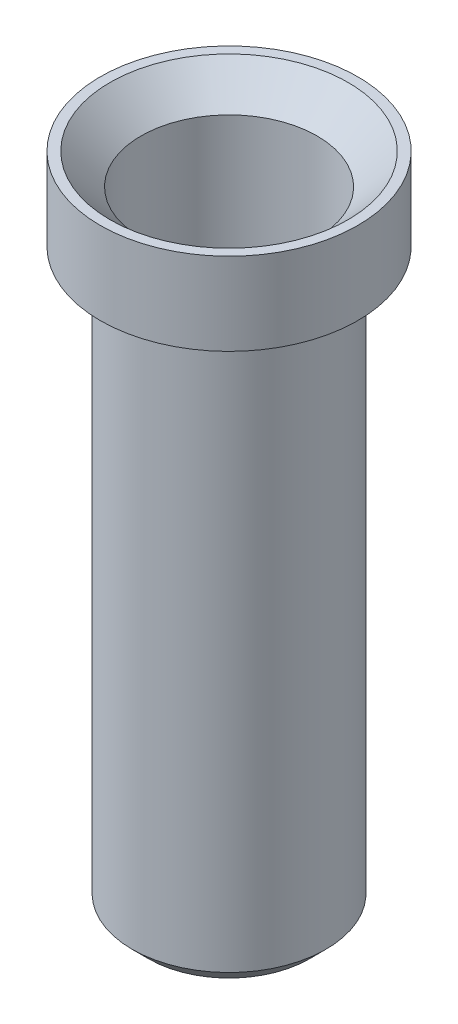
ISO-10303-21;
HEADER;
FILE_DESCRIPTION(('STEP AP214'),'2;1');
FILE_NAME('part.step','',(''),(''),'','','');
FILE_SCHEMA(('AUTOMOTIVE_DESIGN { 1 0 10303 214 1 1 1 1 }'));
ENDSEC;
DATA;
#1=APPLICATION_CONTEXT('core data for automotive mechanical design processes');
#2=APPLICATION_PROTOCOL_DEFINITION('international standard','automotive_design',2000,#1);
#3=PRODUCT_CONTEXT('',#1,'mechanical');
#4=PRODUCT('Part','Part','',(#3));
#5=PRODUCT_RELATED_PRODUCT_CATEGORY('part','',(#4));
#6=PRODUCT_DEFINITION_FORMATION('','',#4);
#7=PRODUCT_DEFINITION_CONTEXT('part definition',#1,'design');
#8=PRODUCT_DEFINITION('design','',#6,#7);
#9=PRODUCT_DEFINITION_SHAPE('','',#8);
#10=(LENGTH_UNIT() NAMED_UNIT(*) SI_UNIT(.MILLI.,.METRE.));
#11=(NAMED_UNIT(*) PLANE_ANGLE_UNIT() SI_UNIT($,.RADIAN.));
#12=(NAMED_UNIT(*) SI_UNIT($,.STERADIAN.) SOLID_ANGLE_UNIT());
#13=UNCERTAINTY_MEASURE_WITH_UNIT(LENGTH_MEASURE(1.E-05),#10,'distance_accuracy_value','');
#14=(GEOMETRIC_REPRESENTATION_CONTEXT(3) GLOBAL_UNCERTAINTY_ASSIGNED_CONTEXT((#13)) GLOBAL_UNIT_ASSIGNED_CONTEXT((#10,
#11,#12)) REPRESENTATION_CONTEXT('',''));
#15=CARTESIAN_POINT('',(0.,0.,0.));
#16=DIRECTION('',(0.,0.,1.));
#17=DIRECTION('',(1.,0.,0.));
#18=AXIS2_PLACEMENT_3D('',#15,#16,#17);
#19=CARTESIAN_POINT('',(0.,-5.6,0.));
#20=DIRECTION('',(0.,-1.,0.));
#21=DIRECTION('',(0.,0.,-1.));
#22=AXIS2_PLACEMENT_3D('',#19,#20,#21);
#23=PLANE('',#22);
#24=CARTESIAN_POINT('',(0.,-5.6,0.));
#25=DIRECTION('',(0.,-1.,0.));
#26=DIRECTION('',(0.,0.,-1.));
#27=AXIS2_PLACEMENT_3D('',#24,#25,#26);
#28=CIRCLE('',#27,0.779999999999999);
#29=CARTESIAN_POINT('',(0.,-5.6,0.78));
#30=VERTEX_POINT('',#29);
#31=EDGE_CURVE('E11',#30,#30,#28,.T.);
#32=ORIENTED_EDGE('',*,*,#31,.T.);
#33=EDGE_LOOP('',(#32));
#34=FACE_BOUND('',#33,.T.);
#35=ADVANCED_FACE('F35',(#34),#23,.T.);
#36=CARTESIAN_POINT('',(0.,8.23878905517164,0.));
#37=DIRECTION('',(0.,1.,0.));
#38=DIRECTION('',(0.,0.,1.));
#39=AXIS2_PLACEMENT_3D('',#36,#37,#38);
#40=CYLINDRICAL_SURFACE('',#39,0.94);
#41=CARTESIAN_POINT('',(0.,-5.44,0.));
#42=DIRECTION('',(0.,-1.,0.));
#43=DIRECTION('',(0.,0.,-1.));
#44=AXIS2_PLACEMENT_3D('',#41,#42,#43);
#45=CIRCLE('',#44,0.94);
#46=CARTESIAN_POINT('',(0.,-5.44,0.94));
#47=VERTEX_POINT('',#46);
#48=EDGE_CURVE('E42',#47,#47,#45,.F.);
#49=ORIENTED_EDGE('',*,*,#48,.T.);
#50=EDGE_LOOP('',(#49));
#51=FACE_BOUND('',#50,.T.);
#52=CARTESIAN_POINT('',(0.,0.,0.));
#53=DIRECTION('',(0.,1.,0.));
#54=DIRECTION('',(0.,0.,1.));
#55=AXIS2_PLACEMENT_3D('',#52,#53,#54);
#56=CIRCLE('',#55,0.940000000000001);
#57=CARTESIAN_POINT('',(0.,0.,0.940000000000001));
#58=VERTEX_POINT('',#57);
#59=EDGE_CURVE('E102',#58,#58,#56,.T.);
#60=ORIENTED_EDGE('',*,*,#59,.F.);
#61=EDGE_LOOP('',(#60));
#62=FACE_BOUND('',#61,.T.);
#63=ADVANCED_FACE('F60',(#51,#62),#40,.T.);
#64=CARTESIAN_POINT('',(-0.940000000000001,0.,0.));
#65=DIRECTION('',(0.,-1.,0.));
#66=DIRECTION('',(0.,0.,-1.));
#67=AXIS2_PLACEMENT_3D('',#64,#65,#66);
#68=PLANE('',#67);
#69=ORIENTED_EDGE('',*,*,#59,.T.);
#70=EDGE_LOOP('',(#69));
#71=FACE_BOUND('',#70,.T.);
#72=CARTESIAN_POINT('',(0.,0.,0.));
#73=DIRECTION('',(0.,1.,0.));
#74=DIRECTION('',(0.,0.,1.));
#75=AXIS2_PLACEMENT_3D('',#72,#73,#74);
#76=CIRCLE('',#75,1.25);
#77=CARTESIAN_POINT('',(0.,0.,1.25));
#78=VERTEX_POINT('',#77);
#79=EDGE_CURVE('E99',#78,#78,#76,.T.);
#80=ORIENTED_EDGE('',*,*,#79,.F.);
#81=EDGE_LOOP('',(#80));
#82=FACE_BOUND('',#81,.T.);
#83=ADVANCED_FACE('F65',(#71,#82),#68,.T.);
#84=CARTESIAN_POINT('',(0.,8.23878905517164,0.));
#85=DIRECTION('',(0.,1.,0.));
#86=DIRECTION('',(0.,0.,1.));
#87=AXIS2_PLACEMENT_3D('',#84,#85,#86);
#88=CYLINDRICAL_SURFACE('',#87,1.25);
#89=ORIENTED_EDGE('',*,*,#79,.T.);
#90=EDGE_LOOP('',(#89));
#91=FACE_BOUND('',#90,.T.);
#92=CARTESIAN_POINT('',(0.,0.799999999999999,0.));
#93=DIRECTION('',(0.,1.,0.));
#94=DIRECTION('',(0.,0.,1.));
#95=AXIS2_PLACEMENT_3D('',#92,#93,#94);
#96=CIRCLE('',#95,1.25);
#97=CARTESIAN_POINT('',(0.,0.799999999999999,1.25));
#98=VERTEX_POINT('',#97);
#99=EDGE_CURVE('E93',#98,#98,#96,.T.);
#100=ORIENTED_EDGE('',*,*,#99,.F.);
#101=EDGE_LOOP('',(#100));
#102=FACE_BOUND('',#101,.T.);
#103=ADVANCED_FACE('F71',(#91,#102),#88,.T.);
#104=CARTESIAN_POINT('',(-1.25,0.799999999999999,0.));
#105=DIRECTION('',(0.,1.,0.));
#106=DIRECTION('',(0.,0.,1.));
#107=AXIS2_PLACEMENT_3D('',#104,#105,#106);
#108=PLANE('',#107);
#109=ORIENTED_EDGE('',*,*,#99,.T.);
#110=EDGE_LOOP('',(#109));
#111=FACE_BOUND('',#110,.T.);
#112=CARTESIAN_POINT('',(0.,0.799999999999999,0.));
#113=DIRECTION('',(0.,1.,0.));
#114=DIRECTION('',(0.,0.,1.));
#115=AXIS2_PLACEMENT_3D('',#112,#113,#114);
#116=CIRCLE('',#115,1.155);
#117=CARTESIAN_POINT('',(0.,0.799999999999999,1.155));
#118=VERTEX_POINT('',#117);
#119=EDGE_CURVE('E87',#118,#118,#116,.T.);
#120=ORIENTED_EDGE('',*,*,#119,.F.);
#121=EDGE_LOOP('',(#120));
#122=FACE_BOUND('',#121,.T.);
#123=ADVANCED_FACE('F75',(#111,#122),#108,.T.);
#124=CARTESIAN_POINT('',(0.,0.5,0.));
#125=DIRECTION('',(0.,1.,0.));
#126=DIRECTION('',(0.,0.,1.));
#127=AXIS2_PLACEMENT_3D('',#124,#125,#126);
#128=CONICAL_SURFACE('',#127,0.854999999999999,0.785398163397449);
#129=ORIENTED_EDGE('',*,*,#119,.T.);
#130=EDGE_LOOP('',(#129));
#131=FACE_BOUND('',#130,.T.);
#132=CARTESIAN_POINT('',(0.,0.5,0.));
#133=DIRECTION('',(0.,1.,0.));
#134=DIRECTION('',(0.,0.,1.));
#135=AXIS2_PLACEMENT_3D('',#132,#133,#134);
#136=CIRCLE('',#135,0.854999999999999);
#137=CARTESIAN_POINT('',(0.,0.5,0.854999999999999));
#138=VERTEX_POINT('',#137);
#139=EDGE_CURVE('E90',#138,#138,#136,.T.);
#140=ORIENTED_EDGE('',*,*,#139,.F.);
#141=EDGE_LOOP('',(#140));
#142=FACE_BOUND('',#141,.T.);
#143=ADVANCED_FACE('F55',(#131,#142),#128,.F.);
#144=CARTESIAN_POINT('',(0.,8.23878905517164,0.));
#145=DIRECTION('',(0.,1.,0.));
#146=DIRECTION('',(0.,0.,1.));
#147=AXIS2_PLACEMENT_3D('',#144,#145,#146);
#148=CYLINDRICAL_SURFACE('',#147,0.854999999999999);
#149=ORIENTED_EDGE('',*,*,#139,.T.);
#150=EDGE_LOOP('',(#149));
#151=FACE_BOUND('',#150,.T.);
#152=CARTESIAN_POINT('',(0.,-4.4,0.));
#153=DIRECTION('',(0.,1.,0.));
#154=DIRECTION('',(0.,0.,1.));
#155=AXIS2_PLACEMENT_3D('',#152,#153,#154);
#156=CIRCLE('',#155,0.854999999999998);
#157=CARTESIAN_POINT('',(0.,-4.4,0.854999999999998));
#158=VERTEX_POINT('',#157);
#159=EDGE_CURVE('E91',#158,#158,#156,.T.);
#160=ORIENTED_EDGE('',*,*,#159,.F.);
#161=EDGE_LOOP('',(#160));
#162=FACE_BOUND('',#161,.T.);
#163=ADVANCED_FACE('F47',(#151,#162),#148,.F.);
#164=CARTESIAN_POINT('',(0.,-4.97034157018811,0.));
#165=DIRECTION('',(0.,1.,0.));
#166=DIRECTION('',(0.,0.,1.));
#167=AXIS2_PLACEMENT_3D('',#164,#165,#166);
#168=CONICAL_SURFACE('',#167,0.,0.982517199189715);
#169=ORIENTED_EDGE('',*,*,#159,.T.);
#170=EDGE_LOOP('',(#169));
#171=FACE_BOUND('',#170,.T.);
#172=CARTESIAN_POINT('',(0.,-4.97034157018811,0.));
#173=VERTEX_POINT('',#172);
#174=VERTEX_LOOP('',#173);
#175=FACE_BOUND('',#174,.T.);
#176=ADVANCED_FACE('F45',(#171,#175),#168,.F.);
#177=CARTESIAN_POINT('',(0.,-5.44,0.));
#178=DIRECTION('',(0.,1.,0.));
#179=DIRECTION('',(0.,0.,1.));
#180=AXIS2_PLACEMENT_3D('',#177,#178,#179);
#181=CONICAL_SURFACE('',#180,0.94,0.785398163397454);
#182=CARTESIAN_POINT('',(0.,-5.6,0.78));
#183=CARTESIAN_POINT('',(0.,-5.59833333333333,0.781666666666667));
#184=CARTESIAN_POINT('',(0.,-5.59666666666667,0.783333333333333));
#185=CARTESIAN_POINT('',(0.,-5.59333333333333,0.786666666666667));
#186=CARTESIAN_POINT('',(0.,-5.59166666666667,0.788333333333333));
#187=CARTESIAN_POINT('',(0.,-5.58833333333333,0.791666666666667));
#188=CARTESIAN_POINT('',(0.,-5.58666666666667,0.793333333333333));
#189=CARTESIAN_POINT('',(0.,-5.58333333333333,0.796666666666667));
#190=CARTESIAN_POINT('',(0.,-5.58166666666667,0.798333333333333));
#191=CARTESIAN_POINT('',(0.,-5.57833333333333,0.801666666666667));
#192=CARTESIAN_POINT('',(0.,-5.57666666666667,0.803333333333333));
#193=CARTESIAN_POINT('',(0.,-5.57333333333333,0.806666666666667));
#194=CARTESIAN_POINT('',(0.,-5.57166666666667,0.808333333333333));
#195=CARTESIAN_POINT('',(0.,-5.56833333333333,0.811666666666667));
#196=CARTESIAN_POINT('',(0.,-5.56666666666667,0.813333333333333));
#197=CARTESIAN_POINT('',(0.,-5.56333333333333,0.816666666666667));
#198=CARTESIAN_POINT('',(0.,-5.56166666666667,0.818333333333333));
#199=CARTESIAN_POINT('',(0.,-5.55833333333333,0.821666666666667));
#200=CARTESIAN_POINT('',(0.,-5.55666666666667,0.823333333333333));
#201=CARTESIAN_POINT('',(0.,-5.55333333333333,0.826666666666667));
#202=CARTESIAN_POINT('',(0.,-5.55166666666667,0.828333333333333));
#203=CARTESIAN_POINT('',(0.,-5.54833333333333,0.831666666666667));
#204=CARTESIAN_POINT('',(0.,-5.54666666666667,0.833333333333333));
#205=CARTESIAN_POINT('',(0.,-5.54333333333333,0.836666666666667));
#206=CARTESIAN_POINT('',(0.,-5.54166666666667,0.838333333333333));
#207=CARTESIAN_POINT('',(0.,-5.53833333333333,0.841666666666667));
#208=CARTESIAN_POINT('',(0.,-5.53666666666667,0.843333333333333));
#209=CARTESIAN_POINT('',(0.,-5.53333333333333,0.846666666666667));
#210=CARTESIAN_POINT('',(0.,-5.53166666666667,0.848333333333333));
#211=CARTESIAN_POINT('',(0.,-5.52833333333334,0.851666666666667));
#212=CARTESIAN_POINT('',(0.,-5.52666666666667,0.853333333333333));
#213=CARTESIAN_POINT('',(0.,-5.52333333333333,0.856666666666667));
#214=CARTESIAN_POINT('',(0.,-5.52166666666667,0.858333333333333));
#215=CARTESIAN_POINT('',(0.,-5.51833333333333,0.861666666666667));
#216=CARTESIAN_POINT('',(0.,-5.51666666666667,0.863333333333333));
#217=CARTESIAN_POINT('',(0.,-5.51333333333333,0.866666666666667));
#218=CARTESIAN_POINT('',(0.,-5.51166666666667,0.868333333333334));
#219=CARTESIAN_POINT('',(0.,-5.50833333333333,0.871666666666667));
#220=CARTESIAN_POINT('',(0.,-5.50666666666667,0.873333333333334));
#221=CARTESIAN_POINT('',(0.,-5.50333333333333,0.876666666666667));
#222=CARTESIAN_POINT('',(0.,-5.50166666666667,0.878333333333333));
#223=CARTESIAN_POINT('',(0.,-5.49833333333333,0.881666666666667));
#224=CARTESIAN_POINT('',(0.,-5.49666666666667,0.883333333333334));
#225=CARTESIAN_POINT('',(0.,-5.49333333333333,0.886666666666667));
#226=CARTESIAN_POINT('',(0.,-5.49166666666667,0.888333333333333));
#227=CARTESIAN_POINT('',(0.,-5.48833333333334,0.891666666666667));
#228=CARTESIAN_POINT('',(0.,-5.48666666666667,0.893333333333333));
#229=CARTESIAN_POINT('',(0.,-5.48333333333334,0.896666666666667));
#230=CARTESIAN_POINT('',(0.,-5.48166666666667,0.898333333333334));
#231=CARTESIAN_POINT('',(0.,-5.47833333333334,0.901666666666667));
#232=CARTESIAN_POINT('',(0.,-5.47666666666667,0.903333333333333));
#233=CARTESIAN_POINT('',(0.,-5.47333333333334,0.906666666666667));
#234=CARTESIAN_POINT('',(0.,-5.47166666666667,0.908333333333334));
#235=CARTESIAN_POINT('',(0.,-5.46833333333333,0.911666666666667));
#236=CARTESIAN_POINT('',(0.,-5.46666666666667,0.913333333333333));
#237=CARTESIAN_POINT('',(0.,-5.46333333333333,0.916666666666667));
#238=CARTESIAN_POINT('',(0.,-5.46166666666667,0.918333333333333));
#239=CARTESIAN_POINT('',(0.,-5.45833333333333,0.921666666666667));
#240=CARTESIAN_POINT('',(0.,-5.45666666666667,0.923333333333334));
#241=CARTESIAN_POINT('',(0.,-5.45333333333333,0.926666666666667));
#242=CARTESIAN_POINT('',(0.,-5.45166666666667,0.928333333333334));
#243=CARTESIAN_POINT('',(0.,-5.44833333333334,0.931666666666667));
#244=CARTESIAN_POINT('',(0.,-5.44666666666667,0.933333333333334));
#245=CARTESIAN_POINT('',(0.,-5.44333333333334,0.936666666666667));
#246=CARTESIAN_POINT('',(0.,-5.44166666666667,0.938333333333334));
#247=CARTESIAN_POINT('',(0.,-5.44,0.94));
#248=B_SPLINE_CURVE_WITH_KNOTS('',3,(#182,#183,#184,#185,#186,#187,#188,#189,#190,#191,#192,
#193,#194,#195,#196,#197,#198,#199,#200,#201,#202,#203,#204,#205,#206,#207,#208,#209,#210,#211,
#212,#213,#214,#215,#216,#217,#218,#219,#220,#221,#222,#223,#224,#225,#226,#227,#228,#229,#230,
#231,#232,#233,#234,#235,#236,#237,#238,#239,#240,#241,#242,#243,#244,#245,#246,#247),
.UNSPECIFIED.,.F.,.F.,(4,2,2,2,2,2,2,2,2,2,2,2,2,2,2,2,2,2,2,2,2,2,2,2,2,2,2,2,2,2,2,2,4),(0.,
0.00707106781186534,0.0141421356237307,0.021213203435596,0.0282842712474614,0.0353553390593267,
0.0424264068711927,0.049497474683058,0.0565685424949233,0.0636396103067887,0.070710678118654,
0.07778174593052,0.0848528137423853,0.0919238815542507,0.098994949366116,0.106066017177981,
0.113137084989847,0.120208152801713,0.127279220613578,0.134350288425443,0.141421356237309,
0.148492424049174,0.15556349186104,0.162634559672905,0.169705627484771,0.176776695296636,
0.183847763108501,0.190918830920367,0.197989898732233,0.205060966544098,0.212132034355963,
0.219203102167829,0.226274169979694),.UNSPECIFIED.);
#249=EDGE_CURVE('BSEAM37',#30,#47,#248,.T.);
#250=ORIENTED_EDGE('',*,*,#31,.F.);
#251=ORIENTED_EDGE('',*,*,#48,.F.);
#252=ORIENTED_EDGE('',*,*,#249,.T.);
#253=ORIENTED_EDGE('',*,*,#249,.F.);
#254=EDGE_LOOP('',(#250,#252,#251,#253));
#255=FACE_BOUND('',#254,.T.);
#256=ADVANCED_FACE('F37',(#255),#181,.T.);
#257=CLOSED_SHELL('',(#35,#63,#83,#103,#123,#143,#163,#176,#256));
#258=MANIFOLD_SOLID_BREP('B2',#257);
#259=ADVANCED_BREP_SHAPE_REPRESENTATION('',(#18,#258),#14);
#260=SHAPE_DEFINITION_REPRESENTATION(#9,#259);
ENDSEC;
END-ISO-10303-21;
